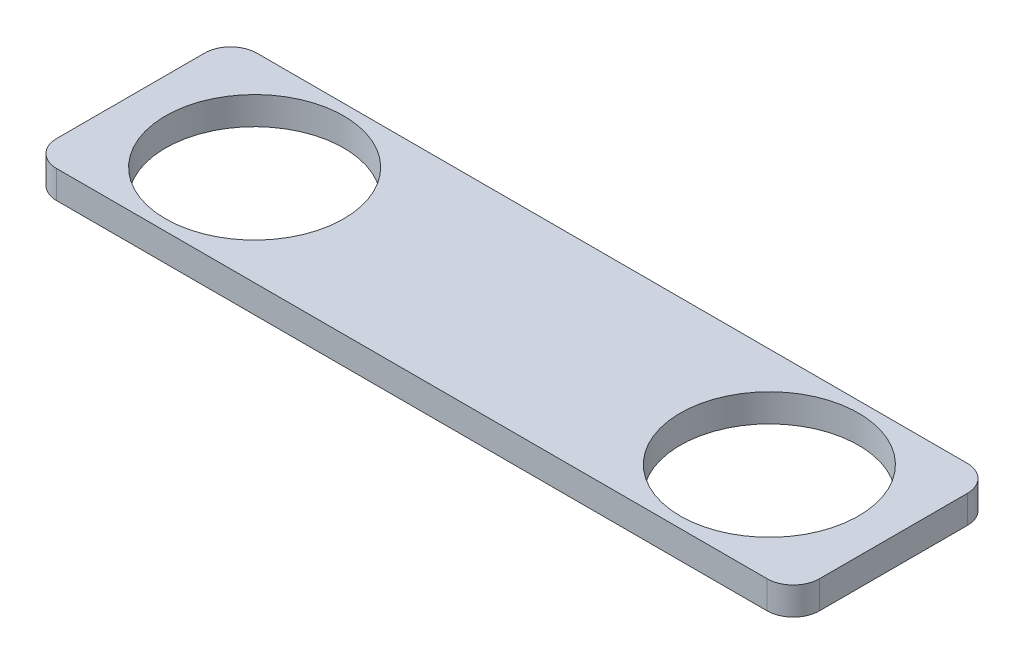
ISO-10303-21;
HEADER;
FILE_DESCRIPTION(('STEP AP214'),'2;1');
FILE_NAME('part.step','',(''),(''),'','','');
FILE_SCHEMA(('AUTOMOTIVE_DESIGN { 1 0 10303 214 1 1 1 1 }'));
ENDSEC;
DATA;
#1=APPLICATION_CONTEXT('core data for automotive mechanical design processes');
#2=APPLICATION_PROTOCOL_DEFINITION('international standard','automotive_design',2000,#1);
#3=PRODUCT_CONTEXT('',#1,'mechanical');
#4=PRODUCT('Part','Part','',(#3));
#5=PRODUCT_RELATED_PRODUCT_CATEGORY('part','',(#4));
#6=PRODUCT_DEFINITION_FORMATION('','',#4);
#7=PRODUCT_DEFINITION_CONTEXT('part definition',#1,'design');
#8=PRODUCT_DEFINITION('design','',#6,#7);
#9=PRODUCT_DEFINITION_SHAPE('','',#8);
#10=(LENGTH_UNIT() NAMED_UNIT(*) SI_UNIT(.MILLI.,.METRE.));
#11=(NAMED_UNIT(*) PLANE_ANGLE_UNIT() SI_UNIT($,.RADIAN.));
#12=(NAMED_UNIT(*) SI_UNIT($,.STERADIAN.) SOLID_ANGLE_UNIT());
#13=UNCERTAINTY_MEASURE_WITH_UNIT(LENGTH_MEASURE(1.E-05),#10,'distance_accuracy_value','');
#14=(GEOMETRIC_REPRESENTATION_CONTEXT(3) GLOBAL_UNCERTAINTY_ASSIGNED_CONTEXT((#13)) GLOBAL_UNIT_ASSIGNED_CONTEXT((#10,
#11,#12)) REPRESENTATION_CONTEXT('',''));
#15=CARTESIAN_POINT('',(0.,0.,0.));
#16=DIRECTION('',(0.,0.,1.));
#17=DIRECTION('',(1.,0.,0.));
#18=AXIS2_PLACEMENT_3D('',#15,#16,#17);
#19=CARTESIAN_POINT('',(-43.841,3.2,11.5));
#20=DIRECTION('',(1.,0.,0.));
#21=DIRECTION('',(0.,0.,1.));
#22=AXIS2_PLACEMENT_3D('',#19,#20,#21);
#23=PLANE('',#22);
#24=DIRECTION('',(0.,0.,1.));
#25=VECTOR('',#24,1.);
#26=CARTESIAN_POINT('',(-43.841,3.2,11.5));
#27=LINE('',#26,#25);
#28=CARTESIAN_POINT('',(-43.841,3.2,-8.5));
#29=VERTEX_POINT('',#28);
#30=CARTESIAN_POINT('',(-43.841,3.2,8.5));
#31=VERTEX_POINT('',#30);
#32=EDGE_CURVE('E146',#29,#31,#27,.T.);
#33=ORIENTED_EDGE('',*,*,#32,.F.);
#34=DIRECTION('',(0.,-1.,0.));
#35=VECTOR('',#34,1.);
#36=CARTESIAN_POINT('',(-43.841,3.2,-8.5));
#37=LINE('',#36,#35);
#38=CARTESIAN_POINT('',(-43.841,0.,-8.5));
#39=VERTEX_POINT('',#38);
#40=EDGE_CURVE('E11',#29,#39,#37,.T.);
#41=ORIENTED_EDGE('',*,*,#40,.T.);
#42=DIRECTION('',(0.,0.,-1.));
#43=VECTOR('',#42,1.);
#44=CARTESIAN_POINT('',(-43.841,0.,0.));
#45=LINE('',#44,#43);
#46=CARTESIAN_POINT('',(-43.841,0.,8.5));
#47=VERTEX_POINT('',#46);
#48=EDGE_CURVE('E147',#39,#47,#45,.F.);
#49=ORIENTED_EDGE('',*,*,#48,.T.);
#50=DIRECTION('',(0.,-1.,0.));
#51=VECTOR('',#50,1.);
#52=CARTESIAN_POINT('',(-43.841,3.2,8.5));
#53=LINE('',#52,#51);
#54=EDGE_CURVE('E51',#47,#31,#53,.F.);
#55=ORIENTED_EDGE('',*,*,#54,.T.);
#56=EDGE_LOOP('',(#33,#41,#49,#55));
#57=FACE_BOUND('',#56,.T.);
#58=ADVANCED_FACE('F43',(#57),#23,.F.);
#59=CARTESIAN_POINT('',(-43.841,3.2,11.5));
#60=DIRECTION('',(0.,0.,-1.));
#61=DIRECTION('',(1.,0.,0.));
#62=AXIS2_PLACEMENT_3D('',#59,#60,#61);
#63=PLANE('',#62);
#64=DIRECTION('',(1.,0.,0.));
#65=VECTOR('',#64,1.);
#66=CARTESIAN_POINT('',(0.,0.,11.5));
#67=LINE('',#66,#65);
#68=CARTESIAN_POINT('',(-40.841,0.,11.5));
#69=VERTEX_POINT('',#68);
#70=CARTESIAN_POINT('',(40.841,0.,11.5));
#71=VERTEX_POINT('',#70);
#72=EDGE_CURVE('E169',#69,#71,#67,.T.);
#73=ORIENTED_EDGE('',*,*,#72,.T.);
#74=DIRECTION('',(0.,-1.,0.));
#75=VECTOR('',#74,1.);
#76=CARTESIAN_POINT('',(40.841,3.2,11.5));
#77=LINE('',#76,#75);
#78=CARTESIAN_POINT('',(40.841,3.2,11.5));
#79=VERTEX_POINT('',#78);
#80=EDGE_CURVE('E134',#71,#79,#77,.F.);
#81=ORIENTED_EDGE('',*,*,#80,.T.);
#82=DIRECTION('',(1.,0.,0.));
#83=VECTOR('',#82,1.);
#84=CARTESIAN_POINT('',(-43.841,3.2,11.5));
#85=LINE('',#84,#83);
#86=CARTESIAN_POINT('',(-40.841,3.2,11.5));
#87=VERTEX_POINT('',#86);
#88=EDGE_CURVE('E157',#87,#79,#85,.T.);
#89=ORIENTED_EDGE('',*,*,#88,.F.);
#90=DIRECTION('',(0.,-1.,0.));
#91=VECTOR('',#90,1.);
#92=CARTESIAN_POINT('',(-40.841,3.2,11.5));
#93=LINE('',#92,#91);
#94=EDGE_CURVE('E137',#87,#69,#93,.T.);
#95=ORIENTED_EDGE('',*,*,#94,.T.);
#96=EDGE_LOOP('',(#73,#81,#89,#95));
#97=FACE_BOUND('',#96,.T.);
#98=ADVANCED_FACE('F200',(#97),#63,.F.);
#99=CARTESIAN_POINT('',(43.841,3.2,11.5));
#100=DIRECTION('',(-1.,0.,0.));
#101=DIRECTION('',(0.,0.,-1.));
#102=AXIS2_PLACEMENT_3D('',#99,#100,#101);
#103=PLANE('',#102);
#104=DIRECTION('',(0.,0.,-1.));
#105=VECTOR('',#104,1.);
#106=CARTESIAN_POINT('',(43.841,0.,0.));
#107=LINE('',#106,#105);
#108=CARTESIAN_POINT('',(43.841,0.,8.5));
#109=VERTEX_POINT('',#108);
#110=CARTESIAN_POINT('',(43.841,0.,-8.5));
#111=VERTEX_POINT('',#110);
#112=EDGE_CURVE('E113',#109,#111,#107,.T.);
#113=ORIENTED_EDGE('',*,*,#112,.T.);
#114=DIRECTION('',(0.,-1.,0.));
#115=VECTOR('',#114,1.);
#116=CARTESIAN_POINT('',(43.841,3.2,-8.5));
#117=LINE('',#116,#115);
#118=CARTESIAN_POINT('',(43.841,3.2,-8.5));
#119=VERTEX_POINT('',#118);
#120=EDGE_CURVE('E119',#111,#119,#117,.F.);
#121=ORIENTED_EDGE('',*,*,#120,.T.);
#122=DIRECTION('',(0.,0.,-1.));
#123=VECTOR('',#122,1.);
#124=CARTESIAN_POINT('',(43.841,3.2,11.5));
#125=LINE('',#124,#123);
#126=CARTESIAN_POINT('',(43.841,3.2,8.5));
#127=VERTEX_POINT('',#126);
#128=EDGE_CURVE('E116',#127,#119,#125,.T.);
#129=ORIENTED_EDGE('',*,*,#128,.F.);
#130=DIRECTION('',(0.,-1.,0.));
#131=VECTOR('',#130,1.);
#132=CARTESIAN_POINT('',(43.841,3.2,8.5));
#133=LINE('',#132,#131);
#134=EDGE_CURVE('E109',#127,#109,#133,.T.);
#135=ORIENTED_EDGE('',*,*,#134,.T.);
#136=EDGE_LOOP('',(#113,#121,#129,#135));
#137=FACE_BOUND('',#136,.T.);
#138=ADVANCED_FACE('F111',(#137),#103,.F.);
#139=CARTESIAN_POINT('',(-43.841,3.2,-11.5));
#140=DIRECTION('',(0.,0.,1.));
#141=DIRECTION('',(-1.,0.,0.));
#142=AXIS2_PLACEMENT_3D('',#139,#140,#141);
#143=PLANE('',#142);
#144=DIRECTION('',(-1.,0.,0.));
#145=VECTOR('',#144,1.);
#146=CARTESIAN_POINT('',(-43.841,3.2,-11.5));
#147=LINE('',#146,#145);
#148=CARTESIAN_POINT('',(40.841,3.2,-11.5));
#149=VERTEX_POINT('',#148);
#150=CARTESIAN_POINT('',(-40.841,3.2,-11.5));
#151=VERTEX_POINT('',#150);
#152=EDGE_CURVE('E158',#149,#151,#147,.T.);
#153=ORIENTED_EDGE('',*,*,#152,.F.);
#154=DIRECTION('',(0.,-1.,0.));
#155=VECTOR('',#154,1.);
#156=CARTESIAN_POINT('',(40.841,3.2,-11.5));
#157=LINE('',#156,#155);
#158=CARTESIAN_POINT('',(40.841,0.,-11.5));
#159=VERTEX_POINT('',#158);
#160=EDGE_CURVE('E190',#149,#159,#157,.T.);
#161=ORIENTED_EDGE('',*,*,#160,.T.);
#162=DIRECTION('',(1.,0.,0.));
#163=VECTOR('',#162,1.);
#164=CARTESIAN_POINT('',(0.,0.,-11.5));
#165=LINE('',#164,#163);
#166=CARTESIAN_POINT('',(-40.841,0.,-11.5));
#167=VERTEX_POINT('',#166);
#168=EDGE_CURVE('E129',#159,#167,#165,.F.);
#169=ORIENTED_EDGE('',*,*,#168,.T.);
#170=DIRECTION('',(0.,-1.,0.));
#171=VECTOR('',#170,1.);
#172=CARTESIAN_POINT('',(-40.841,3.2,-11.5));
#173=LINE('',#172,#171);
#174=EDGE_CURVE('E187',#167,#151,#173,.F.);
#175=ORIENTED_EDGE('',*,*,#174,.T.);
#176=EDGE_LOOP('',(#153,#161,#169,#175));
#177=FACE_BOUND('',#176,.T.);
#178=ADVANCED_FACE('F194',(#177),#143,.F.);
#179=CARTESIAN_POINT('',(29.591,3.2,0.));
#180=DIRECTION('',(0.,-1.,0.));
#181=DIRECTION('',(0.,0.,-1.));
#182=AXIS2_PLACEMENT_3D('',#179,#180,#181);
#183=CYLINDRICAL_SURFACE('',#182,10.25);
#184=CARTESIAN_POINT('',(29.591,3.2,0.));
#185=DIRECTION('',(0.,1.,0.));
#186=DIRECTION('',(0.,0.,1.));
#187=AXIS2_PLACEMENT_3D('',#184,#185,#186);
#188=CIRCLE('',#187,10.25);
#189=CARTESIAN_POINT('',(29.591,3.2,10.25));
#190=VERTEX_POINT('',#189);
#191=EDGE_CURVE('E160',#190,#190,#188,.T.);
#192=ORIENTED_EDGE('',*,*,#191,.T.);
#193=EDGE_LOOP('',(#192));
#194=FACE_BOUND('',#193,.T.);
#195=CARTESIAN_POINT('',(29.591,0.,0.));
#196=DIRECTION('',(0.,1.,0.));
#197=DIRECTION('',(0.,0.,1.));
#198=AXIS2_PLACEMENT_3D('',#195,#196,#197);
#199=CIRCLE('',#198,10.25);
#200=CARTESIAN_POINT('',(29.591,0.,10.25));
#201=VERTEX_POINT('',#200);
#202=EDGE_CURVE('E171',#201,#201,#199,.T.);
#203=ORIENTED_EDGE('',*,*,#202,.F.);
#204=EDGE_LOOP('',(#203));
#205=FACE_BOUND('',#204,.T.);
#206=ADVANCED_FACE('F219',(#194,#205),#183,.F.);
#207=CARTESIAN_POINT('',(-29.591,3.2,0.));
#208=DIRECTION('',(0.,-1.,0.));
#209=DIRECTION('',(0.,0.,-1.));
#210=AXIS2_PLACEMENT_3D('',#207,#208,#209);
#211=CYLINDRICAL_SURFACE('',#210,10.25);
#212=CARTESIAN_POINT('',(-29.591,3.2,0.));
#213=DIRECTION('',(0.,1.,0.));
#214=DIRECTION('',(0.,0.,1.));
#215=AXIS2_PLACEMENT_3D('',#212,#213,#214);
#216=CIRCLE('',#215,10.25);
#217=CARTESIAN_POINT('',(-29.591,3.2,10.25));
#218=VERTEX_POINT('',#217);
#219=EDGE_CURVE('E120',#218,#218,#216,.T.);
#220=ORIENTED_EDGE('',*,*,#219,.T.);
#221=EDGE_LOOP('',(#220));
#222=FACE_BOUND('',#221,.T.);
#223=CARTESIAN_POINT('',(-29.591,0.,0.));
#224=DIRECTION('',(0.,1.,0.));
#225=DIRECTION('',(0.,0.,1.));
#226=AXIS2_PLACEMENT_3D('',#223,#224,#225);
#227=CIRCLE('',#226,10.25);
#228=CARTESIAN_POINT('',(-29.591,0.,10.25));
#229=VERTEX_POINT('',#228);
#230=EDGE_CURVE('E177',#229,#229,#227,.T.);
#231=ORIENTED_EDGE('',*,*,#230,.F.);
#232=EDGE_LOOP('',(#231));
#233=FACE_BOUND('',#232,.T.);
#234=ADVANCED_FACE('F222',(#222,#233),#211,.F.);
#235=CARTESIAN_POINT('',(0.,3.2,0.));
#236=DIRECTION('',(0.,-1.,0.));
#237=DIRECTION('',(0.,0.,-1.));
#238=AXIS2_PLACEMENT_3D('',#235,#236,#237);
#239=PLANE('',#238);
#240=ORIENTED_EDGE('',*,*,#128,.T.);
#241=CARTESIAN_POINT('',(40.841,3.2,-8.5));
#242=DIRECTION('',(0.,-1.,0.));
#243=DIRECTION('',(0.,0.,-1.));
#244=AXIS2_PLACEMENT_3D('',#241,#242,#243);
#245=CIRCLE('',#244,3.);
#246=EDGE_CURVE('E185',#119,#149,#245,.F.);
#247=ORIENTED_EDGE('',*,*,#246,.T.);
#248=ORIENTED_EDGE('',*,*,#152,.T.);
#249=CARTESIAN_POINT('',(-40.841,3.2,-8.5));
#250=DIRECTION('',(0.,-1.,0.));
#251=DIRECTION('',(0.,0.,-1.));
#252=AXIS2_PLACEMENT_3D('',#249,#250,#251);
#253=CIRCLE('',#252,3.);
#254=EDGE_CURVE('E156',#151,#29,#253,.F.);
#255=ORIENTED_EDGE('',*,*,#254,.T.);
#256=ORIENTED_EDGE('',*,*,#32,.T.);
#257=CARTESIAN_POINT('',(-40.841,3.2,8.5));
#258=DIRECTION('',(0.,-1.,0.));
#259=DIRECTION('',(0.,0.,-1.));
#260=AXIS2_PLACEMENT_3D('',#257,#258,#259);
#261=CIRCLE('',#260,3.);
#262=EDGE_CURVE('E153',#31,#87,#261,.F.);
#263=ORIENTED_EDGE('',*,*,#262,.T.);
#264=ORIENTED_EDGE('',*,*,#88,.T.);
#265=CARTESIAN_POINT('',(40.841,3.2,8.5));
#266=DIRECTION('',(0.,-1.,0.));
#267=DIRECTION('',(0.,0.,-1.));
#268=AXIS2_PLACEMENT_3D('',#265,#266,#267);
#269=CIRCLE('',#268,3.);
#270=EDGE_CURVE('E183',#79,#127,#269,.F.);
#271=ORIENTED_EDGE('',*,*,#270,.T.);
#272=EDGE_LOOP('',(#240,#247,#248,#255,#256,#263,#264,#271));
#273=FACE_BOUND('',#272,.T.);
#274=ORIENTED_EDGE('',*,*,#191,.F.);
#275=EDGE_LOOP('',(#274));
#276=FACE_BOUND('',#275,.T.);
#277=ORIENTED_EDGE('',*,*,#219,.F.);
#278=EDGE_LOOP('',(#277));
#279=FACE_BOUND('',#278,.T.);
#280=ADVANCED_FACE('F150',(#273,#276,#279),#239,.F.);
#281=CARTESIAN_POINT('',(0.,0.,0.));
#282=DIRECTION('',(0.,-1.,0.));
#283=DIRECTION('',(0.,0.,-1.));
#284=AXIS2_PLACEMENT_3D('',#281,#282,#283);
#285=PLANE('',#284);
#286=ORIENTED_EDGE('',*,*,#168,.F.);
#287=CARTESIAN_POINT('',(40.841,0.,-8.5));
#288=DIRECTION('',(0.,-1.,0.));
#289=DIRECTION('',(0.,0.,-1.));
#290=AXIS2_PLACEMENT_3D('',#287,#288,#289);
#291=CIRCLE('',#290,3.);
#292=EDGE_CURVE('E128',#159,#111,#291,.T.);
#293=ORIENTED_EDGE('',*,*,#292,.T.);
#294=ORIENTED_EDGE('',*,*,#112,.F.);
#295=CARTESIAN_POINT('',(40.841,0.,8.5));
#296=DIRECTION('',(0.,-1.,0.));
#297=DIRECTION('',(0.,0.,-1.));
#298=AXIS2_PLACEMENT_3D('',#295,#296,#297);
#299=CIRCLE('',#298,3.);
#300=EDGE_CURVE('E125',#109,#71,#299,.T.);
#301=ORIENTED_EDGE('',*,*,#300,.T.);
#302=ORIENTED_EDGE('',*,*,#72,.F.);
#303=CARTESIAN_POINT('',(-40.841,0.,8.5));
#304=DIRECTION('',(0.,-1.,0.));
#305=DIRECTION('',(0.,0.,-1.));
#306=AXIS2_PLACEMENT_3D('',#303,#304,#305);
#307=CIRCLE('',#306,3.);
#308=EDGE_CURVE('E58',#69,#47,#307,.T.);
#309=ORIENTED_EDGE('',*,*,#308,.T.);
#310=ORIENTED_EDGE('',*,*,#48,.F.);
#311=CARTESIAN_POINT('',(-40.841,0.,-8.5));
#312=DIRECTION('',(0.,-1.,0.));
#313=DIRECTION('',(0.,0.,-1.));
#314=AXIS2_PLACEMENT_3D('',#311,#312,#313);
#315=CIRCLE('',#314,3.);
#316=EDGE_CURVE('E135',#39,#167,#315,.T.);
#317=ORIENTED_EDGE('',*,*,#316,.T.);
#318=EDGE_LOOP('',(#286,#293,#294,#301,#302,#309,#310,#317));
#319=FACE_BOUND('',#318,.T.);
#320=ORIENTED_EDGE('',*,*,#202,.T.);
#321=EDGE_LOOP('',(#320));
#322=FACE_BOUND('',#321,.T.);
#323=ORIENTED_EDGE('',*,*,#230,.T.);
#324=EDGE_LOOP('',(#323));
#325=FACE_BOUND('',#324,.T.);
#326=ADVANCED_FACE('F123',(#319,#322,#325),#285,.T.);
#327=CARTESIAN_POINT('',(40.841,3.2,-8.5));
#328=DIRECTION('',(0.,1.,0.));
#329=DIRECTION('',(0.,0.,1.));
#330=AXIS2_PLACEMENT_3D('',#327,#328,#329);
#331=CYLINDRICAL_SURFACE('',#330,3.);
#332=ORIENTED_EDGE('',*,*,#292,.F.);
#333=ORIENTED_EDGE('',*,*,#160,.F.);
#334=ORIENTED_EDGE('',*,*,#246,.F.);
#335=ORIENTED_EDGE('',*,*,#120,.F.);
#336=EDGE_LOOP('',(#332,#333,#334,#335));
#337=FACE_BOUND('',#336,.T.);
#338=ADVANCED_FACE('F198',(#337),#331,.T.);
#339=CARTESIAN_POINT('',(40.841,3.2,8.5));
#340=DIRECTION('',(0.,1.,0.));
#341=DIRECTION('',(0.,0.,1.));
#342=AXIS2_PLACEMENT_3D('',#339,#340,#341);
#343=CYLINDRICAL_SURFACE('',#342,3.);
#344=ORIENTED_EDGE('',*,*,#300,.F.);
#345=ORIENTED_EDGE('',*,*,#134,.F.);
#346=ORIENTED_EDGE('',*,*,#270,.F.);
#347=ORIENTED_EDGE('',*,*,#80,.F.);
#348=EDGE_LOOP('',(#344,#345,#346,#347));
#349=FACE_BOUND('',#348,.T.);
#350=ADVANCED_FACE('F132',(#349),#343,.T.);
#351=CARTESIAN_POINT('',(-40.841,3.2,-8.5));
#352=DIRECTION('',(0.,1.,0.));
#353=DIRECTION('',(0.,0.,1.));
#354=AXIS2_PLACEMENT_3D('',#351,#352,#353);
#355=CYLINDRICAL_SURFACE('',#354,3.);
#356=ORIENTED_EDGE('',*,*,#316,.F.);
#357=ORIENTED_EDGE('',*,*,#40,.F.);
#358=ORIENTED_EDGE('',*,*,#254,.F.);
#359=ORIENTED_EDGE('',*,*,#174,.F.);
#360=EDGE_LOOP('',(#356,#357,#358,#359));
#361=FACE_BOUND('',#360,.T.);
#362=ADVANCED_FACE('F203',(#361),#355,.T.);
#363=CARTESIAN_POINT('',(-40.841,3.2,8.5));
#364=DIRECTION('',(0.,1.,0.));
#365=DIRECTION('',(0.,0.,1.));
#366=AXIS2_PLACEMENT_3D('',#363,#364,#365);
#367=CYLINDRICAL_SURFACE('',#366,3.);
#368=ORIENTED_EDGE('',*,*,#308,.F.);
#369=ORIENTED_EDGE('',*,*,#94,.F.);
#370=ORIENTED_EDGE('',*,*,#262,.F.);
#371=ORIENTED_EDGE('',*,*,#54,.F.);
#372=EDGE_LOOP('',(#368,#369,#370,#371));
#373=FACE_BOUND('',#372,.T.);
#374=ADVANCED_FACE('F45',(#373),#367,.T.);
#375=CLOSED_SHELL('',(#58,#98,#138,#178,#206,#234,#280,#326,#338,#350,#362,#374));
#376=MANIFOLD_SOLID_BREP('B2',#375);
#377=ADVANCED_BREP_SHAPE_REPRESENTATION('',(#18,#376),#14);
#378=SHAPE_DEFINITION_REPRESENTATION(#9,#377);
ENDSEC;
END-ISO-10303-21;
